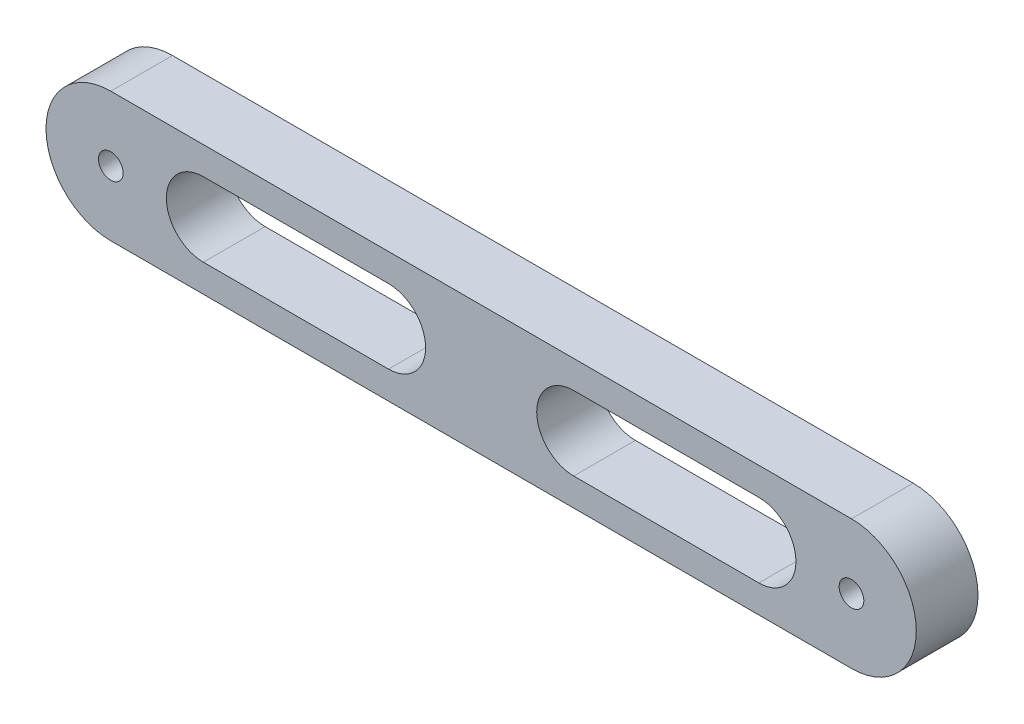
ISO-10303-21;
HEADER;
FILE_DESCRIPTION(('STEP AP214'),'2;1');
FILE_NAME('part.step','',(''),(''),'','','');
FILE_SCHEMA(('AUTOMOTIVE_DESIGN { 1 0 10303 214 1 1 1 1 }'));
ENDSEC;
DATA;
#1=APPLICATION_CONTEXT('core data for automotive mechanical design processes');
#2=APPLICATION_PROTOCOL_DEFINITION('international standard','automotive_design',2000,#1);
#3=PRODUCT_CONTEXT('',#1,'mechanical');
#4=PRODUCT('Part','Part','',(#3));
#5=PRODUCT_RELATED_PRODUCT_CATEGORY('part','',(#4));
#6=PRODUCT_DEFINITION_FORMATION('','',#4);
#7=PRODUCT_DEFINITION_CONTEXT('part definition',#1,'design');
#8=PRODUCT_DEFINITION('design','',#6,#7);
#9=PRODUCT_DEFINITION_SHAPE('','',#8);
#10=(LENGTH_UNIT() NAMED_UNIT(*) SI_UNIT(.MILLI.,.METRE.));
#11=(NAMED_UNIT(*) PLANE_ANGLE_UNIT() SI_UNIT($,.RADIAN.));
#12=(NAMED_UNIT(*) SI_UNIT($,.STERADIAN.) SOLID_ANGLE_UNIT());
#13=UNCERTAINTY_MEASURE_WITH_UNIT(LENGTH_MEASURE(1.E-05),#10,'distance_accuracy_value','');
#14=(GEOMETRIC_REPRESENTATION_CONTEXT(3) GLOBAL_UNCERTAINTY_ASSIGNED_CONTEXT((#13)) GLOBAL_UNIT_ASSIGNED_CONTEXT((#10,
#11,#12)) REPRESENTATION_CONTEXT('',''));
#15=CARTESIAN_POINT('',(0.,0.,0.));
#16=DIRECTION('',(0.,0.,1.));
#17=DIRECTION('',(1.,0.,0.));
#18=AXIS2_PLACEMENT_3D('',#15,#16,#17);
#19=CARTESIAN_POINT('',(0.,0.,50.));
#20=DIRECTION('',(0.,0.,-1.));
#21=DIRECTION('',(-1.,0.,0.));
#22=AXIS2_PLACEMENT_3D('',#19,#20,#21);
#23=CYLINDRICAL_SURFACE('',#22,52.5);
#24=CARTESIAN_POINT('',(0.,0.,0.));
#25=DIRECTION('',(0.,0.,1.));
#26=DIRECTION('',(1.,0.,0.));
#27=AXIS2_PLACEMENT_3D('',#24,#25,#26);
#28=CIRCLE('',#27,52.5);
#29=CARTESIAN_POINT('',(0.,52.5,0.));
#30=VERTEX_POINT('',#29);
#31=CARTESIAN_POINT('',(0.,-52.5,0.));
#32=VERTEX_POINT('',#31);
#33=EDGE_CURVE('E201',#30,#32,#28,.T.);
#34=ORIENTED_EDGE('',*,*,#33,.T.);
#35=DIRECTION('',(0.,0.,-1.));
#36=VECTOR('',#35,1.);
#37=CARTESIAN_POINT('',(0.,-52.5,50.));
#38=LINE('',#37,#36);
#39=CARTESIAN_POINT('',(0.,-52.5,50.));
#40=VERTEX_POINT('',#39);
#41=EDGE_CURVE('E11',#40,#32,#38,.T.);
#42=ORIENTED_EDGE('',*,*,#41,.F.);
#43=CARTESIAN_POINT('',(0.,0.,50.));
#44=DIRECTION('',(0.,0.,1.));
#45=DIRECTION('',(1.,0.,0.));
#46=AXIS2_PLACEMENT_3D('',#43,#44,#45);
#47=CIRCLE('',#46,52.5);
#48=CARTESIAN_POINT('',(0.,52.5,50.));
#49=VERTEX_POINT('',#48);
#50=EDGE_CURVE('E207',#49,#40,#47,.T.);
#51=ORIENTED_EDGE('',*,*,#50,.F.);
#52=DIRECTION('',(0.,0.,-1.));
#53=VECTOR('',#52,1.);
#54=CARTESIAN_POINT('',(0.,52.5,50.));
#55=LINE('',#54,#53);
#56=EDGE_CURVE('E217',#49,#30,#55,.T.);
#57=ORIENTED_EDGE('',*,*,#56,.T.);
#58=EDGE_LOOP('',(#34,#42,#51,#57));
#59=FACE_BOUND('',#58,.T.);
#60=ADVANCED_FACE('F41',(#59),#23,.T.);
#61=CARTESIAN_POINT('',(0.,-52.5,50.));
#62=DIRECTION('',(0.,1.,0.));
#63=DIRECTION('',(0.,0.,1.));
#64=AXIS2_PLACEMENT_3D('',#61,#62,#63);
#65=PLANE('',#64);
#66=DIRECTION('',(1.,0.,0.));
#67=VECTOR('',#66,1.);
#68=CARTESIAN_POINT('',(0.,-52.5,0.));
#69=LINE('',#68,#67);
#70=CARTESIAN_POINT('',(600.,-52.5,0.));
#71=VERTEX_POINT('',#70);
#72=EDGE_CURVE('E220',#32,#71,#69,.T.);
#73=ORIENTED_EDGE('',*,*,#72,.T.);
#74=DIRECTION('',(0.,0.,-1.));
#75=VECTOR('',#74,1.);
#76=CARTESIAN_POINT('',(600.,-52.5,50.));
#77=LINE('',#76,#75);
#78=CARTESIAN_POINT('',(600.,-52.5,50.));
#79=VERTEX_POINT('',#78);
#80=EDGE_CURVE('E48',#79,#71,#77,.T.);
#81=ORIENTED_EDGE('',*,*,#80,.F.);
#82=DIRECTION('',(1.,0.,0.));
#83=VECTOR('',#82,1.);
#84=CARTESIAN_POINT('',(0.,-52.5,50.));
#85=LINE('',#84,#83);
#86=EDGE_CURVE('E210',#40,#79,#85,.T.);
#87=ORIENTED_EDGE('',*,*,#86,.F.);
#88=ORIENTED_EDGE('',*,*,#41,.T.);
#89=EDGE_LOOP('',(#73,#81,#87,#88));
#90=FACE_BOUND('',#89,.T.);
#91=ADVANCED_FACE('F249',(#90),#65,.F.);
#92=CARTESIAN_POINT('',(600.,0.,50.));
#93=DIRECTION('',(0.,0.,-1.));
#94=DIRECTION('',(-1.,0.,0.));
#95=AXIS2_PLACEMENT_3D('',#92,#93,#94);
#96=CYLINDRICAL_SURFACE('',#95,52.5);
#97=CARTESIAN_POINT('',(600.,0.,0.));
#98=DIRECTION('',(0.,0.,1.));
#99=DIRECTION('',(1.,0.,0.));
#100=AXIS2_PLACEMENT_3D('',#97,#98,#99);
#101=CIRCLE('',#100,52.5);
#102=CARTESIAN_POINT('',(600.,52.5,0.));
#103=VERTEX_POINT('',#102);
#104=EDGE_CURVE('E222',#71,#103,#101,.T.);
#105=ORIENTED_EDGE('',*,*,#104,.T.);
#106=DIRECTION('',(0.,0.,-1.));
#107=VECTOR('',#106,1.);
#108=CARTESIAN_POINT('',(600.,52.5,50.));
#109=LINE('',#108,#107);
#110=CARTESIAN_POINT('',(600.,52.5,50.));
#111=VERTEX_POINT('',#110);
#112=EDGE_CURVE('E227',#111,#103,#109,.T.);
#113=ORIENTED_EDGE('',*,*,#112,.F.);
#114=CARTESIAN_POINT('',(600.,0.,50.));
#115=DIRECTION('',(0.,0.,1.));
#116=DIRECTION('',(1.,0.,0.));
#117=AXIS2_PLACEMENT_3D('',#114,#115,#116);
#118=CIRCLE('',#117,52.5);
#119=EDGE_CURVE('E213',#79,#111,#118,.T.);
#120=ORIENTED_EDGE('',*,*,#119,.F.);
#121=ORIENTED_EDGE('',*,*,#80,.T.);
#122=EDGE_LOOP('',(#105,#113,#120,#121));
#123=FACE_BOUND('',#122,.T.);
#124=ADVANCED_FACE('F234',(#123),#96,.T.);
#125=CARTESIAN_POINT('',(0.,52.5,50.));
#126=DIRECTION('',(0.,-1.,0.));
#127=DIRECTION('',(0.,0.,-1.));
#128=AXIS2_PLACEMENT_3D('',#125,#126,#127);
#129=PLANE('',#128);
#130=DIRECTION('',(-1.,0.,0.));
#131=VECTOR('',#130,1.);
#132=CARTESIAN_POINT('',(0.,52.5,0.));
#133=LINE('',#132,#131);
#134=EDGE_CURVE('E211',#103,#30,#133,.T.);
#135=ORIENTED_EDGE('',*,*,#134,.T.);
#136=ORIENTED_EDGE('',*,*,#56,.F.);
#137=DIRECTION('',(-1.,0.,0.));
#138=VECTOR('',#137,1.);
#139=CARTESIAN_POINT('',(0.,52.5,50.));
#140=LINE('',#139,#138);
#141=EDGE_CURVE('E215',#111,#49,#140,.T.);
#142=ORIENTED_EDGE('',*,*,#141,.F.);
#143=ORIENTED_EDGE('',*,*,#112,.T.);
#144=EDGE_LOOP('',(#135,#136,#142,#143));
#145=FACE_BOUND('',#144,.T.);
#146=ADVANCED_FACE('F243',(#145),#129,.F.);
#147=CARTESIAN_POINT('',(0.,0.,50.));
#148=DIRECTION('',(0.,0.,1.));
#149=DIRECTION('',(1.,0.,0.));
#150=AXIS2_PLACEMENT_3D('',#147,#148,#149);
#151=PLANE('',#150);
#152=CARTESIAN_POINT('',(600.,0.,50.));
#153=DIRECTION('',(0.,0.,1.));
#154=DIRECTION('',(1.,0.,0.));
#155=AXIS2_PLACEMENT_3D('',#152,#153,#154);
#156=CIRCLE('',#155,9.99999999999998);
#157=CARTESIAN_POINT('',(610.,0.,50.));
#158=VERTEX_POINT('',#157);
#159=EDGE_CURVE('E168',#158,#158,#156,.T.);
#160=ORIENTED_EDGE('',*,*,#159,.F.);
#161=EDGE_LOOP('',(#160));
#162=FACE_BOUND('',#161,.T.);
#163=CARTESIAN_POINT('',(0.,0.,50.));
#164=DIRECTION('',(0.,0.,1.));
#165=DIRECTION('',(1.,0.,0.));
#166=AXIS2_PLACEMENT_3D('',#163,#164,#165);
#167=CIRCLE('',#166,10.);
#168=CARTESIAN_POINT('',(10.,0.,50.));
#169=VERTEX_POINT('',#168);
#170=EDGE_CURVE('E153',#169,#169,#167,.T.);
#171=ORIENTED_EDGE('',*,*,#170,.F.);
#172=EDGE_LOOP('',(#171));
#173=FACE_BOUND('',#172,.T.);
#174=CARTESIAN_POINT('',(75.,0.,50.));
#175=DIRECTION('',(0.,0.,1.));
#176=DIRECTION('',(1.,0.,0.));
#177=AXIS2_PLACEMENT_3D('',#174,#175,#176);
#178=CIRCLE('',#177,30.);
#179=CARTESIAN_POINT('',(75.,30.,50.));
#180=VERTEX_POINT('',#179);
#181=CARTESIAN_POINT('',(75.,-30.,50.));
#182=VERTEX_POINT('',#181);
#183=EDGE_CURVE('E55',#180,#182,#178,.T.);
#184=ORIENTED_EDGE('',*,*,#183,.F.);
#185=DIRECTION('',(1.,0.,0.));
#186=VECTOR('',#185,1.);
#187=CARTESIAN_POINT('',(75.,30.,50.));
#188=LINE('',#187,#186);
#189=CARTESIAN_POINT('',(225.,30.,50.));
#190=VERTEX_POINT('',#189);
#191=EDGE_CURVE('E137',#180,#190,#188,.T.);
#192=ORIENTED_EDGE('',*,*,#191,.T.);
#193=CARTESIAN_POINT('',(225.,0.,50.));
#194=DIRECTION('',(0.,0.,1.));
#195=DIRECTION('',(1.,0.,0.));
#196=AXIS2_PLACEMENT_3D('',#193,#194,#195);
#197=CIRCLE('',#196,30.);
#198=CARTESIAN_POINT('',(225.,-30.,50.));
#199=VERTEX_POINT('',#198);
#200=EDGE_CURVE('E143',#199,#190,#197,.T.);
#201=ORIENTED_EDGE('',*,*,#200,.F.);
#202=DIRECTION('',(1.,0.,0.));
#203=VECTOR('',#202,1.);
#204=CARTESIAN_POINT('',(75.,-30.,50.));
#205=LINE('',#204,#203);
#206=EDGE_CURVE('E149',#182,#199,#205,.T.);
#207=ORIENTED_EDGE('',*,*,#206,.F.);
#208=EDGE_LOOP('',(#184,#192,#201,#207));
#209=FACE_BOUND('',#208,.T.);
#210=DIRECTION('',(1.,0.,0.));
#211=VECTOR('',#210,1.);
#212=CARTESIAN_POINT('',(0.,-30.,50.));
#213=LINE('',#212,#211);
#214=CARTESIAN_POINT('',(375.,-30.,50.));
#215=VERTEX_POINT('',#214);
#216=CARTESIAN_POINT('',(525.,-30.,50.));
#217=VERTEX_POINT('',#216);
#218=EDGE_CURVE('E63',#215,#217,#213,.T.);
#219=ORIENTED_EDGE('',*,*,#218,.F.);
#220=CARTESIAN_POINT('',(375.,0.,50.));
#221=DIRECTION('',(0.,0.,1.));
#222=DIRECTION('',(1.,0.,0.));
#223=AXIS2_PLACEMENT_3D('',#220,#221,#222);
#224=CIRCLE('',#223,30.);
#225=CARTESIAN_POINT('',(375.,30.,50.));
#226=VERTEX_POINT('',#225);
#227=EDGE_CURVE('E180',#226,#215,#224,.T.);
#228=ORIENTED_EDGE('',*,*,#227,.F.);
#229=DIRECTION('',(1.,0.,0.));
#230=VECTOR('',#229,1.);
#231=CARTESIAN_POINT('',(0.,30.,50.));
#232=LINE('',#231,#230);
#233=CARTESIAN_POINT('',(525.,30.,50.));
#234=VERTEX_POINT('',#233);
#235=EDGE_CURVE('E194',#226,#234,#232,.T.);
#236=ORIENTED_EDGE('',*,*,#235,.T.);
#237=CARTESIAN_POINT('',(525.,0.,50.));
#238=DIRECTION('',(0.,0.,1.));
#239=DIRECTION('',(1.,0.,0.));
#240=AXIS2_PLACEMENT_3D('',#237,#238,#239);
#241=CIRCLE('',#240,30.);
#242=EDGE_CURVE('E191',#217,#234,#241,.T.);
#243=ORIENTED_EDGE('',*,*,#242,.F.);
#244=EDGE_LOOP('',(#219,#228,#236,#243));
#245=FACE_BOUND('',#244,.T.);
#246=ORIENTED_EDGE('',*,*,#50,.T.);
#247=ORIENTED_EDGE('',*,*,#86,.T.);
#248=ORIENTED_EDGE('',*,*,#119,.T.);
#249=ORIENTED_EDGE('',*,*,#141,.T.);
#250=EDGE_LOOP('',(#246,#247,#248,#249));
#251=FACE_BOUND('',#250,.T.);
#252=ADVANCED_FACE('F146',(#162,#173,#209,#245,#251),#151,.T.);
#253=CARTESIAN_POINT('',(0.,0.,0.));
#254=DIRECTION('',(0.,0.,1.));
#255=DIRECTION('',(1.,0.,0.));
#256=AXIS2_PLACEMENT_3D('',#253,#254,#255);
#257=PLANE('',#256);
#258=CARTESIAN_POINT('',(600.,0.,0.));
#259=DIRECTION('',(0.,0.,1.));
#260=DIRECTION('',(1.,0.,0.));
#261=AXIS2_PLACEMENT_3D('',#258,#259,#260);
#262=CIRCLE('',#261,9.99999999999998);
#263=CARTESIAN_POINT('',(610.,0.,0.));
#264=VERTEX_POINT('',#263);
#265=EDGE_CURVE('E171',#264,#264,#262,.T.);
#266=ORIENTED_EDGE('',*,*,#265,.T.);
#267=EDGE_LOOP('',(#266));
#268=FACE_BOUND('',#267,.T.);
#269=CARTESIAN_POINT('',(0.,0.,0.));
#270=DIRECTION('',(0.,0.,1.));
#271=DIRECTION('',(1.,0.,0.));
#272=AXIS2_PLACEMENT_3D('',#269,#270,#271);
#273=CIRCLE('',#272,10.);
#274=CARTESIAN_POINT('',(10.,0.,0.));
#275=VERTEX_POINT('',#274);
#276=EDGE_CURVE('E150',#275,#275,#273,.T.);
#277=ORIENTED_EDGE('',*,*,#276,.T.);
#278=EDGE_LOOP('',(#277));
#279=FACE_BOUND('',#278,.T.);
#280=DIRECTION('',(1.,0.,0.));
#281=VECTOR('',#280,1.);
#282=CARTESIAN_POINT('',(75.,30.,0.));
#283=LINE('',#282,#281);
#284=CARTESIAN_POINT('',(75.,30.,0.));
#285=VERTEX_POINT('',#284);
#286=CARTESIAN_POINT('',(225.,30.,0.));
#287=VERTEX_POINT('',#286);
#288=EDGE_CURVE('E158',#285,#287,#283,.T.);
#289=ORIENTED_EDGE('',*,*,#288,.F.);
#290=CARTESIAN_POINT('',(75.,0.,0.));
#291=DIRECTION('',(0.,0.,1.));
#292=DIRECTION('',(1.,0.,0.));
#293=AXIS2_PLACEMENT_3D('',#290,#291,#292);
#294=CIRCLE('',#293,30.);
#295=CARTESIAN_POINT('',(75.,-30.,0.));
#296=VERTEX_POINT('',#295);
#297=EDGE_CURVE('E131',#285,#296,#294,.T.);
#298=ORIENTED_EDGE('',*,*,#297,.T.);
#299=DIRECTION('',(1.,0.,0.));
#300=VECTOR('',#299,1.);
#301=CARTESIAN_POINT('',(75.,-30.,0.));
#302=LINE('',#301,#300);
#303=CARTESIAN_POINT('',(225.,-30.,0.));
#304=VERTEX_POINT('',#303);
#305=EDGE_CURVE('E164',#296,#304,#302,.T.);
#306=ORIENTED_EDGE('',*,*,#305,.T.);
#307=CARTESIAN_POINT('',(225.,0.,0.));
#308=DIRECTION('',(0.,0.,1.));
#309=DIRECTION('',(1.,0.,0.));
#310=AXIS2_PLACEMENT_3D('',#307,#308,#309);
#311=CIRCLE('',#310,30.);
#312=EDGE_CURVE('E160',#304,#287,#311,.T.);
#313=ORIENTED_EDGE('',*,*,#312,.T.);
#314=EDGE_LOOP('',(#289,#298,#306,#313));
#315=FACE_BOUND('',#314,.T.);
#316=CARTESIAN_POINT('',(375.,0.,0.));
#317=DIRECTION('',(0.,0.,1.));
#318=DIRECTION('',(1.,0.,0.));
#319=AXIS2_PLACEMENT_3D('',#316,#317,#318);
#320=CIRCLE('',#319,30.);
#321=CARTESIAN_POINT('',(375.,30.,0.));
#322=VERTEX_POINT('',#321);
#323=CARTESIAN_POINT('',(375.,-30.,0.));
#324=VERTEX_POINT('',#323);
#325=EDGE_CURVE('E186',#322,#324,#320,.T.);
#326=ORIENTED_EDGE('',*,*,#325,.T.);
#327=DIRECTION('',(1.,0.,0.));
#328=VECTOR('',#327,1.);
#329=CARTESIAN_POINT('',(0.,-30.,0.));
#330=LINE('',#329,#328);
#331=CARTESIAN_POINT('',(525.,-30.,0.));
#332=VERTEX_POINT('',#331);
#333=EDGE_CURVE('E176',#324,#332,#330,.T.);
#334=ORIENTED_EDGE('',*,*,#333,.T.);
#335=CARTESIAN_POINT('',(525.,0.,0.));
#336=DIRECTION('',(0.,0.,1.));
#337=DIRECTION('',(1.,0.,0.));
#338=AXIS2_PLACEMENT_3D('',#335,#336,#337);
#339=CIRCLE('',#338,30.);
#340=CARTESIAN_POINT('',(525.,30.,0.));
#341=VERTEX_POINT('',#340);
#342=EDGE_CURVE('E179',#332,#341,#339,.T.);
#343=ORIENTED_EDGE('',*,*,#342,.T.);
#344=DIRECTION('',(1.,0.,0.));
#345=VECTOR('',#344,1.);
#346=CARTESIAN_POINT('',(0.,30.,0.));
#347=LINE('',#346,#345);
#348=EDGE_CURVE('E183',#322,#341,#347,.T.);
#349=ORIENTED_EDGE('',*,*,#348,.F.);
#350=EDGE_LOOP('',(#326,#334,#343,#349));
#351=FACE_BOUND('',#350,.T.);
#352=ORIENTED_EDGE('',*,*,#33,.F.);
#353=ORIENTED_EDGE('',*,*,#134,.F.);
#354=ORIENTED_EDGE('',*,*,#104,.F.);
#355=ORIENTED_EDGE('',*,*,#72,.F.);
#356=EDGE_LOOP('',(#352,#353,#354,#355));
#357=FACE_BOUND('',#356,.T.);
#358=ADVANCED_FACE('F240',(#268,#279,#315,#351,#357),#257,.F.);
#359=CARTESIAN_POINT('',(0.,-30.,0.));
#360=DIRECTION('',(0.,-1.,0.));
#361=DIRECTION('',(0.,0.,-1.));
#362=AXIS2_PLACEMENT_3D('',#359,#360,#361);
#363=PLANE('',#362);
#364=ORIENTED_EDGE('',*,*,#218,.T.);
#365=DIRECTION('',(0.,0.,1.));
#366=VECTOR('',#365,1.);
#367=CARTESIAN_POINT('',(525.,-30.,0.));
#368=LINE('',#367,#366);
#369=EDGE_CURVE('E189',#332,#217,#368,.T.);
#370=ORIENTED_EDGE('',*,*,#369,.F.);
#371=ORIENTED_EDGE('',*,*,#333,.F.);
#372=DIRECTION('',(0.,0.,1.));
#373=VECTOR('',#372,1.);
#374=CARTESIAN_POINT('',(375.,-30.,0.));
#375=LINE('',#374,#373);
#376=EDGE_CURVE('E199',#324,#215,#375,.T.);
#377=ORIENTED_EDGE('',*,*,#376,.T.);
#378=EDGE_LOOP('',(#364,#370,#371,#377));
#379=FACE_BOUND('',#378,.T.);
#380=ADVANCED_FACE('F261',(#379),#363,.F.);
#381=CARTESIAN_POINT('',(375.,0.,0.));
#382=DIRECTION('',(0.,0.,1.));
#383=DIRECTION('',(1.,0.,0.));
#384=AXIS2_PLACEMENT_3D('',#381,#382,#383);
#385=CYLINDRICAL_SURFACE('',#384,30.);
#386=ORIENTED_EDGE('',*,*,#227,.T.);
#387=ORIENTED_EDGE('',*,*,#376,.F.);
#388=ORIENTED_EDGE('',*,*,#325,.F.);
#389=DIRECTION('',(0.,0.,1.));
#390=VECTOR('',#389,1.);
#391=CARTESIAN_POINT('',(375.,30.,0.));
#392=LINE('',#391,#390);
#393=EDGE_CURVE('E202',#322,#226,#392,.T.);
#394=ORIENTED_EDGE('',*,*,#393,.T.);
#395=EDGE_LOOP('',(#386,#387,#388,#394));
#396=FACE_BOUND('',#395,.T.);
#397=ADVANCED_FACE('F268',(#396),#385,.F.);
#398=CARTESIAN_POINT('',(0.,30.,0.));
#399=DIRECTION('',(0.,-1.,0.));
#400=DIRECTION('',(0.,0.,-1.));
#401=AXIS2_PLACEMENT_3D('',#398,#399,#400);
#402=PLANE('',#401);
#403=ORIENTED_EDGE('',*,*,#235,.F.);
#404=ORIENTED_EDGE('',*,*,#393,.F.);
#405=ORIENTED_EDGE('',*,*,#348,.T.);
#406=DIRECTION('',(0.,0.,1.));
#407=VECTOR('',#406,1.);
#408=CARTESIAN_POINT('',(525.,30.,0.));
#409=LINE('',#408,#407);
#410=EDGE_CURVE('E204',#341,#234,#409,.T.);
#411=ORIENTED_EDGE('',*,*,#410,.T.);
#412=EDGE_LOOP('',(#403,#404,#405,#411));
#413=FACE_BOUND('',#412,.T.);
#414=ADVANCED_FACE('F272',(#413),#402,.T.);
#415=CARTESIAN_POINT('',(525.,0.,0.));
#416=DIRECTION('',(0.,0.,1.));
#417=DIRECTION('',(1.,0.,0.));
#418=AXIS2_PLACEMENT_3D('',#415,#416,#417);
#419=CYLINDRICAL_SURFACE('',#418,30.);
#420=ORIENTED_EDGE('',*,*,#242,.T.);
#421=ORIENTED_EDGE('',*,*,#410,.F.);
#422=ORIENTED_EDGE('',*,*,#342,.F.);
#423=ORIENTED_EDGE('',*,*,#369,.T.);
#424=EDGE_LOOP('',(#420,#421,#422,#423));
#425=FACE_BOUND('',#424,.T.);
#426=ADVANCED_FACE('F269',(#425),#419,.F.);
#427=CARTESIAN_POINT('',(75.,0.,0.));
#428=DIRECTION('',(0.,0.,1.));
#429=DIRECTION('',(1.,0.,0.));
#430=AXIS2_PLACEMENT_3D('',#427,#428,#429);
#431=CYLINDRICAL_SURFACE('',#430,30.);
#432=ORIENTED_EDGE('',*,*,#183,.T.);
#433=DIRECTION('',(0.,0.,1.));
#434=VECTOR('',#433,1.);
#435=CARTESIAN_POINT('',(75.,-30.,0.));
#436=LINE('',#435,#434);
#437=EDGE_CURVE('E161',#296,#182,#436,.T.);
#438=ORIENTED_EDGE('',*,*,#437,.F.);
#439=ORIENTED_EDGE('',*,*,#297,.F.);
#440=DIRECTION('',(0.,0.,1.));
#441=VECTOR('',#440,1.);
#442=CARTESIAN_POINT('',(75.,30.,0.));
#443=LINE('',#442,#441);
#444=EDGE_CURVE('E127',#285,#180,#443,.T.);
#445=ORIENTED_EDGE('',*,*,#444,.T.);
#446=EDGE_LOOP('',(#432,#438,#439,#445));
#447=FACE_BOUND('',#446,.T.);
#448=ADVANCED_FACE('F129',(#447),#431,.F.);
#449=CARTESIAN_POINT('',(75.,30.,0.));
#450=DIRECTION('',(0.,-1.,0.));
#451=DIRECTION('',(0.,0.,-1.));
#452=AXIS2_PLACEMENT_3D('',#449,#450,#451);
#453=PLANE('',#452);
#454=ORIENTED_EDGE('',*,*,#191,.F.);
#455=ORIENTED_EDGE('',*,*,#444,.F.);
#456=ORIENTED_EDGE('',*,*,#288,.T.);
#457=DIRECTION('',(0.,0.,1.));
#458=VECTOR('',#457,1.);
#459=CARTESIAN_POINT('',(225.,30.,0.));
#460=LINE('',#459,#458);
#461=EDGE_CURVE('E134',#287,#190,#460,.T.);
#462=ORIENTED_EDGE('',*,*,#461,.T.);
#463=EDGE_LOOP('',(#454,#455,#456,#462));
#464=FACE_BOUND('',#463,.T.);
#465=ADVANCED_FACE('F138',(#464),#453,.T.);
#466=CARTESIAN_POINT('',(225.,0.,0.));
#467=DIRECTION('',(0.,0.,1.));
#468=DIRECTION('',(1.,0.,0.));
#469=AXIS2_PLACEMENT_3D('',#466,#467,#468);
#470=CYLINDRICAL_SURFACE('',#469,30.);
#471=ORIENTED_EDGE('',*,*,#200,.T.);
#472=ORIENTED_EDGE('',*,*,#461,.F.);
#473=ORIENTED_EDGE('',*,*,#312,.F.);
#474=DIRECTION('',(0.,0.,1.));
#475=VECTOR('',#474,1.);
#476=CARTESIAN_POINT('',(225.,-30.,0.));
#477=LINE('',#476,#475);
#478=EDGE_CURVE('E395',#304,#199,#477,.T.);
#479=ORIENTED_EDGE('',*,*,#478,.T.);
#480=EDGE_LOOP('',(#471,#472,#473,#479));
#481=FACE_BOUND('',#480,.T.);
#482=ADVANCED_FACE('F291',(#481),#470,.F.);
#483=CARTESIAN_POINT('',(75.,-30.,0.));
#484=DIRECTION('',(0.,-1.,0.));
#485=DIRECTION('',(0.,0.,-1.));
#486=AXIS2_PLACEMENT_3D('',#483,#484,#485);
#487=PLANE('',#486);
#488=ORIENTED_EDGE('',*,*,#206,.T.);
#489=ORIENTED_EDGE('',*,*,#478,.F.);
#490=ORIENTED_EDGE('',*,*,#305,.F.);
#491=ORIENTED_EDGE('',*,*,#437,.T.);
#492=EDGE_LOOP('',(#488,#489,#490,#491));
#493=FACE_BOUND('',#492,.T.);
#494=ADVANCED_FACE('F284',(#493),#487,.F.);
#495=CARTESIAN_POINT('',(0.,0.,0.));
#496=DIRECTION('',(0.,0.,1.));
#497=DIRECTION('',(1.,0.,0.));
#498=AXIS2_PLACEMENT_3D('',#495,#496,#497);
#499=CYLINDRICAL_SURFACE('',#498,10.);
#500=ORIENTED_EDGE('',*,*,#276,.F.);
#501=EDGE_LOOP('',(#500));
#502=FACE_BOUND('',#501,.T.);
#503=ORIENTED_EDGE('',*,*,#170,.T.);
#504=EDGE_LOOP('',(#503));
#505=FACE_BOUND('',#504,.T.);
#506=ADVANCED_FACE('F280',(#502,#505),#499,.F.);
#507=CARTESIAN_POINT('',(600.,0.,0.));
#508=DIRECTION('',(0.,0.,1.));
#509=DIRECTION('',(1.,0.,0.));
#510=AXIS2_PLACEMENT_3D('',#507,#508,#509);
#511=CYLINDRICAL_SURFACE('',#510,9.99999999999998);
#512=ORIENTED_EDGE('',*,*,#265,.F.);
#513=EDGE_LOOP('',(#512));
#514=FACE_BOUND('',#513,.T.);
#515=ORIENTED_EDGE('',*,*,#159,.T.);
#516=EDGE_LOOP('',(#515));
#517=FACE_BOUND('',#516,.T.);
#518=ADVANCED_FACE('F283',(#514,#517),#511,.F.);
#519=CLOSED_SHELL('',(#60,#91,#124,#146,#252,#358,#380,#397,#414,#426,#448,#465,#482,#494,#506,#518));
#520=MANIFOLD_SOLID_BREP('B2',#519);
#521=ADVANCED_BREP_SHAPE_REPRESENTATION('',(#18,#520),#14);
#522=SHAPE_DEFINITION_REPRESENTATION(#9,#521);
ENDSEC;
END-ISO-10303-21;
